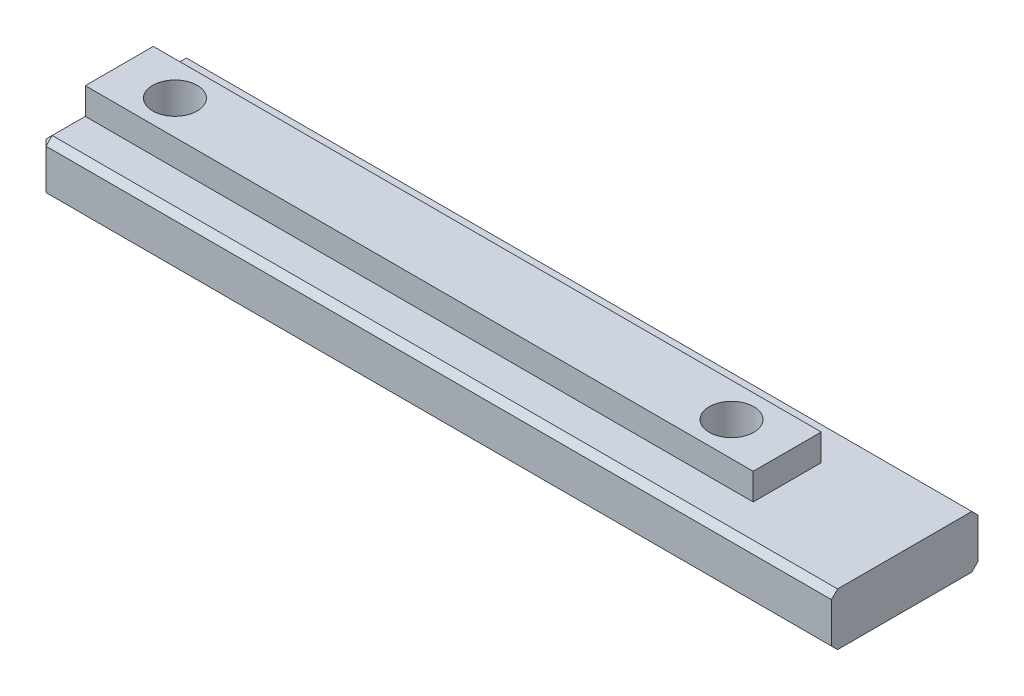
ISO-10303-21;
HEADER;
FILE_DESCRIPTION(('STEP AP214'),'2;1');
FILE_NAME('part.step','',(''),(''),'','','');
FILE_SCHEMA(('AUTOMOTIVE_DESIGN { 1 0 10303 214 1 1 1 1 }'));
ENDSEC;
DATA;
#1=APPLICATION_CONTEXT('core data for automotive mechanical design processes');
#2=APPLICATION_PROTOCOL_DEFINITION('international standard','automotive_design',2000,#1);
#3=PRODUCT_CONTEXT('',#1,'mechanical');
#4=PRODUCT('Part','Part','',(#3));
#5=PRODUCT_RELATED_PRODUCT_CATEGORY('part','',(#4));
#6=PRODUCT_DEFINITION_FORMATION('','',#4);
#7=PRODUCT_DEFINITION_CONTEXT('part definition',#1,'design');
#8=PRODUCT_DEFINITION('design','',#6,#7);
#9=PRODUCT_DEFINITION_SHAPE('','',#8);
#10=(LENGTH_UNIT() NAMED_UNIT(*) SI_UNIT(.MILLI.,.METRE.));
#11=(NAMED_UNIT(*) PLANE_ANGLE_UNIT() SI_UNIT($,.RADIAN.));
#12=(NAMED_UNIT(*) SI_UNIT($,.STERADIAN.) SOLID_ANGLE_UNIT());
#13=UNCERTAINTY_MEASURE_WITH_UNIT(LENGTH_MEASURE(1.E-05),#10,'distance_accuracy_value','');
#14=(GEOMETRIC_REPRESENTATION_CONTEXT(3) GLOBAL_UNCERTAINTY_ASSIGNED_CONTEXT((#13)) GLOBAL_UNIT_ASSIGNED_CONTEXT((#10,
#11,#12)) REPRESENTATION_CONTEXT('',''));
#15=CARTESIAN_POINT('',(0.,0.,0.));
#16=DIRECTION('',(0.,0.,1.));
#17=DIRECTION('',(1.,0.,0.));
#18=AXIS2_PLACEMENT_3D('',#15,#16,#17);
#19=CARTESIAN_POINT('',(0.,0.,0.));
#20=DIRECTION('',(0.,1.,0.));
#21=DIRECTION('',(0.,0.,1.));
#22=AXIS2_PLACEMENT_3D('',#19,#20,#21);
#23=PLANE('',#22);
#24=DIRECTION('',(1.,0.,0.));
#25=VECTOR('',#24,1.);
#26=CARTESIAN_POINT('',(0.,0.,-5.425));
#27=LINE('',#26,#25);
#28=CARTESIAN_POINT('',(-27.,0.,-5.425));
#29=VERTEX_POINT('',#28);
#30=CARTESIAN_POINT('',(36.5,0.,-5.425));
#31=VERTEX_POINT('',#30);
#32=EDGE_CURVE('E304',#29,#31,#27,.T.);
#33=ORIENTED_EDGE('',*,*,#32,.T.);
#34=DIRECTION('',(0.,0.,-1.));
#35=VECTOR('',#34,1.);
#36=CARTESIAN_POINT('',(36.5,0.,5.425));
#37=LINE('',#36,#35);
#38=CARTESIAN_POINT('',(36.5,0.,5.425));
#39=VERTEX_POINT('',#38);
#40=EDGE_CURVE('E207',#39,#31,#37,.T.);
#41=ORIENTED_EDGE('',*,*,#40,.F.);
#42=DIRECTION('',(-1.,0.,0.));
#43=VECTOR('',#42,1.);
#44=CARTESIAN_POINT('',(0.,0.,5.425));
#45=LINE('',#44,#43);
#46=CARTESIAN_POINT('',(-27.,0.,5.425));
#47=VERTEX_POINT('',#46);
#48=EDGE_CURVE('E11',#39,#47,#45,.T.);
#49=ORIENTED_EDGE('',*,*,#48,.T.);
#50=DIRECTION('',(0.,0.,-1.));
#51=VECTOR('',#50,1.);
#52=CARTESIAN_POINT('',(-27.,0.,0.));
#53=LINE('',#52,#51);
#54=EDGE_CURVE('E49',#47,#29,#53,.T.);
#55=ORIENTED_EDGE('',*,*,#54,.T.);
#56=EDGE_LOOP('',(#33,#41,#49,#55));
#57=FACE_BOUND('',#56,.T.);
#58=CARTESIAN_POINT('',(-22.5,0.,0.));
#59=DIRECTION('',(0.,-1.,0.));
#60=DIRECTION('',(0.,0.,-1.));
#61=AXIS2_PLACEMENT_3D('',#58,#59,#60);
#62=CIRCLE('',#61,3.275);
#63=CARTESIAN_POINT('',(-22.5,0.,-3.275));
#64=VERTEX_POINT('',#63);
#65=EDGE_CURVE('E231',#64,#64,#62,.T.);
#66=ORIENTED_EDGE('',*,*,#65,.F.);
#67=EDGE_LOOP('',(#66));
#68=FACE_BOUND('',#67,.T.);
#69=CARTESIAN_POINT('',(22.5,0.,0.));
#70=DIRECTION('',(0.,-1.,0.));
#71=DIRECTION('',(0.,0.,-1.));
#72=AXIS2_PLACEMENT_3D('',#69,#70,#71);
#73=CIRCLE('',#72,3.275);
#74=CARTESIAN_POINT('',(22.5,0.,-3.27499999999999));
#75=VERTEX_POINT('',#74);
#76=EDGE_CURVE('E216',#75,#75,#73,.T.);
#77=ORIENTED_EDGE('',*,*,#76,.F.);
#78=EDGE_LOOP('',(#77));
#79=FACE_BOUND('',#78,.T.);
#80=DIRECTION('',(1.,0.,0.));
#81=VECTOR('',#80,1.);
#82=CARTESIAN_POINT('',(31.1499999999999,0.,2.));
#83=LINE('',#82,#81);
#84=CARTESIAN_POINT('',(31.1499999999999,0.,2.));
#85=VERTEX_POINT('',#84);
#86=CARTESIAN_POINT('',(34.4499999999999,0.,2.));
#87=VERTEX_POINT('',#86);
#88=EDGE_CURVE('E184',#85,#87,#83,.T.);
#89=ORIENTED_EDGE('',*,*,#88,.T.);
#90=DIRECTION('',(0.,0.,-1.));
#91=VECTOR('',#90,1.);
#92=CARTESIAN_POINT('',(34.4499999999999,0.,2.));
#93=LINE('',#92,#91);
#94=CARTESIAN_POINT('',(34.4499999999999,0.,-2.));
#95=VERTEX_POINT('',#94);
#96=EDGE_CURVE('E170',#87,#95,#93,.T.);
#97=ORIENTED_EDGE('',*,*,#96,.T.);
#98=DIRECTION('',(1.,0.,0.));
#99=VECTOR('',#98,1.);
#100=CARTESIAN_POINT('',(31.1499999999999,0.,-2.));
#101=LINE('',#100,#99);
#102=CARTESIAN_POINT('',(31.1499999999999,0.,-2.));
#103=VERTEX_POINT('',#102);
#104=EDGE_CURVE('E176',#103,#95,#101,.T.);
#105=ORIENTED_EDGE('',*,*,#104,.F.);
#106=DIRECTION('',(0.,0.,-1.));
#107=VECTOR('',#106,1.);
#108=CARTESIAN_POINT('',(31.1499999999999,0.,2.));
#109=LINE('',#108,#107);
#110=EDGE_CURVE('E185',#85,#103,#109,.T.);
#111=ORIENTED_EDGE('',*,*,#110,.F.);
#112=EDGE_LOOP('',(#89,#97,#105,#111));
#113=FACE_BOUND('',#112,.T.);
#114=ADVANCED_FACE('F39',(#57,#68,#79,#113),#23,.F.);
#115=CARTESIAN_POINT('',(0.,4.25,0.));
#116=DIRECTION('',(0.,1.,0.));
#117=DIRECTION('',(0.,0.,1.));
#118=AXIS2_PLACEMENT_3D('',#115,#116,#117);
#119=PLANE('',#118);
#120=DIRECTION('',(0.,0.,-1.));
#121=VECTOR('',#120,1.);
#122=CARTESIAN_POINT('',(27.,4.25,2.75));
#123=LINE('',#122,#121);
#124=CARTESIAN_POINT('',(27.,4.25,2.75));
#125=VERTEX_POINT('',#124);
#126=CARTESIAN_POINT('',(27.,4.25,-2.75));
#127=VERTEX_POINT('',#126);
#128=EDGE_CURVE('E65',#125,#127,#123,.T.);
#129=ORIENTED_EDGE('',*,*,#128,.F.);
#130=DIRECTION('',(-1.,0.,0.));
#131=VECTOR('',#130,1.);
#132=CARTESIAN_POINT('',(27.,4.25,2.75));
#133=LINE('',#132,#131);
#134=CARTESIAN_POINT('',(-27.,4.25,2.75));
#135=VERTEX_POINT('',#134);
#136=EDGE_CURVE('E271',#125,#135,#133,.T.);
#137=ORIENTED_EDGE('',*,*,#136,.T.);
#138=DIRECTION('',(0.,0.,1.));
#139=VECTOR('',#138,1.);
#140=CARTESIAN_POINT('',(-27.,4.25,5.925));
#141=LINE('',#140,#139);
#142=CARTESIAN_POINT('',(-27.,4.25,5.425));
#143=VERTEX_POINT('',#142);
#144=EDGE_CURVE('E292',#135,#143,#141,.T.);
#145=ORIENTED_EDGE('',*,*,#144,.T.);
#146=DIRECTION('',(1.,0.,0.));
#147=VECTOR('',#146,1.);
#148=CARTESIAN_POINT('',(27.5,4.25,5.425));
#149=LINE('',#148,#147);
#150=CARTESIAN_POINT('',(36.5,4.25,5.425));
#151=VERTEX_POINT('',#150);
#152=EDGE_CURVE('E296',#143,#151,#149,.T.);
#153=ORIENTED_EDGE('',*,*,#152,.T.);
#154=DIRECTION('',(0.,0.,1.));
#155=VECTOR('',#154,1.);
#156=CARTESIAN_POINT('',(36.5,4.25,-5.425));
#157=LINE('',#156,#155);
#158=CARTESIAN_POINT('',(36.5,4.25,-5.425));
#159=VERTEX_POINT('',#158);
#160=EDGE_CURVE('E195',#159,#151,#157,.T.);
#161=ORIENTED_EDGE('',*,*,#160,.F.);
#162=DIRECTION('',(-1.,0.,0.));
#163=VECTOR('',#162,1.);
#164=CARTESIAN_POINT('',(-27.5,4.25,-5.425));
#165=LINE('',#164,#163);
#166=CARTESIAN_POINT('',(-27.,4.25,-5.425));
#167=VERTEX_POINT('',#166);
#168=EDGE_CURVE('E290',#159,#167,#165,.T.);
#169=ORIENTED_EDGE('',*,*,#168,.T.);
#170=CARTESIAN_POINT('',(-27.,4.25,-2.75));
#171=VERTEX_POINT('',#170);
#172=EDGE_CURVE('E293',#167,#171,#141,.T.);
#173=ORIENTED_EDGE('',*,*,#172,.T.);
#174=DIRECTION('',(-1.,0.,0.));
#175=VECTOR('',#174,1.);
#176=CARTESIAN_POINT('',(27.,4.25,-2.75));
#177=LINE('',#176,#175);
#178=EDGE_CURVE('E268',#127,#171,#177,.T.);
#179=ORIENTED_EDGE('',*,*,#178,.F.);
#180=EDGE_LOOP('',(#129,#137,#145,#153,#161,#169,#173,#179));
#181=FACE_BOUND('',#180,.T.);
#182=ADVANCED_FACE('F351',(#181),#119,.T.);
#183=CARTESIAN_POINT('',(-27.5,4.25,-5.925));
#184=DIRECTION('',(0.,0.,1.));
#185=DIRECTION('',(1.,0.,0.));
#186=AXIS2_PLACEMENT_3D('',#183,#184,#185);
#187=PLANE('',#186);
#188=DIRECTION('',(0.,1.,0.));
#189=VECTOR('',#188,1.);
#190=CARTESIAN_POINT('',(-27.,4.25,-5.925));
#191=LINE('',#190,#189);
#192=CARTESIAN_POINT('',(-27.,0.5,-5.925));
#193=VERTEX_POINT('',#192);
#194=CARTESIAN_POINT('',(-27.,3.75,-5.925));
#195=VERTEX_POINT('',#194);
#196=EDGE_CURVE('E300',#193,#195,#191,.T.);
#197=ORIENTED_EDGE('',*,*,#196,.T.);
#198=DIRECTION('',(1.,0.,0.));
#199=VECTOR('',#198,1.);
#200=CARTESIAN_POINT('',(27.5,3.75,-5.925));
#201=LINE('',#200,#199);
#202=CARTESIAN_POINT('',(36.5,3.75,-5.925));
#203=VERTEX_POINT('',#202);
#204=EDGE_CURVE('E302',#195,#203,#201,.T.);
#205=ORIENTED_EDGE('',*,*,#204,.T.);
#206=DIRECTION('',(0.,1.,0.));
#207=VECTOR('',#206,1.);
#208=CARTESIAN_POINT('',(36.5,0.5,-5.925));
#209=LINE('',#208,#207);
#210=CARTESIAN_POINT('',(36.5,0.5,-5.925));
#211=VERTEX_POINT('',#210);
#212=EDGE_CURVE('E213',#211,#203,#209,.T.);
#213=ORIENTED_EDGE('',*,*,#212,.F.);
#214=DIRECTION('',(-1.,0.,0.));
#215=VECTOR('',#214,1.);
#216=CARTESIAN_POINT('',(-27.5,0.5,-5.925));
#217=LINE('',#216,#215);
#218=EDGE_CURVE('E298',#211,#193,#217,.T.);
#219=ORIENTED_EDGE('',*,*,#218,.T.);
#220=EDGE_LOOP('',(#197,#205,#213,#219));
#221=FACE_BOUND('',#220,.T.);
#222=ADVANCED_FACE('F389',(#221),#187,.F.);
#223=CARTESIAN_POINT('',(-27.5,4.25,-5.925));
#224=DIRECTION('',(1.,0.,0.));
#225=DIRECTION('',(0.,0.,-1.));
#226=AXIS2_PLACEMENT_3D('',#223,#224,#225);
#227=PLANE('',#226);
#228=DIRECTION('',(0.,0.,1.));
#229=VECTOR('',#228,1.);
#230=CARTESIAN_POINT('',(-27.5,0.5,-5.925));
#231=LINE('',#230,#229);
#232=CARTESIAN_POINT('',(-27.5,0.5,-5.425));
#233=VERTEX_POINT('',#232);
#234=CARTESIAN_POINT('',(-27.5,0.5,5.425));
#235=VERTEX_POINT('',#234);
#236=EDGE_CURVE('E281',#233,#235,#231,.T.);
#237=ORIENTED_EDGE('',*,*,#236,.T.);
#238=DIRECTION('',(0.,1.,0.));
#239=VECTOR('',#238,1.);
#240=CARTESIAN_POINT('',(-27.5,4.25,5.425));
#241=LINE('',#240,#239);
#242=CARTESIAN_POINT('',(-27.5,3.75,5.425));
#243=VERTEX_POINT('',#242);
#244=EDGE_CURVE('E287',#235,#243,#241,.T.);
#245=ORIENTED_EDGE('',*,*,#244,.T.);
#246=DIRECTION('',(0.,0.,-1.));
#247=VECTOR('',#246,1.);
#248=CARTESIAN_POINT('',(-27.5,3.75,-5.925));
#249=LINE('',#248,#247);
#250=CARTESIAN_POINT('',(-27.5,3.75,-5.425));
#251=VERTEX_POINT('',#250);
#252=EDGE_CURVE('E285',#243,#251,#249,.T.);
#253=ORIENTED_EDGE('',*,*,#252,.T.);
#254=DIRECTION('',(0.,-1.,0.));
#255=VECTOR('',#254,1.);
#256=CARTESIAN_POINT('',(-27.5,4.25,-5.425));
#257=LINE('',#256,#255);
#258=EDGE_CURVE('E283',#251,#233,#257,.T.);
#259=ORIENTED_EDGE('',*,*,#258,.T.);
#260=EDGE_LOOP('',(#237,#245,#253,#259));
#261=FACE_BOUND('',#260,.T.);
#262=ADVANCED_FACE('F407',(#261),#227,.F.);
#263=CARTESIAN_POINT('',(-27.5,4.25,5.925));
#264=DIRECTION('',(0.,0.,-1.));
#265=DIRECTION('',(-1.,0.,0.));
#266=AXIS2_PLACEMENT_3D('',#263,#264,#265);
#267=PLANE('',#266);
#268=DIRECTION('',(1.,0.,0.));
#269=VECTOR('',#268,1.);
#270=CARTESIAN_POINT('',(-27.5,0.5,5.925));
#271=LINE('',#270,#269);
#272=CARTESIAN_POINT('',(-27.,0.5,5.925));
#273=VERTEX_POINT('',#272);
#274=CARTESIAN_POINT('',(36.5,0.5,5.925));
#275=VERTEX_POINT('',#274);
#276=EDGE_CURVE('E274',#273,#275,#271,.T.);
#277=ORIENTED_EDGE('',*,*,#276,.T.);
#278=DIRECTION('',(0.,-1.,0.));
#279=VECTOR('',#278,1.);
#280=CARTESIAN_POINT('',(36.5,3.75,5.925));
#281=LINE('',#280,#279);
#282=CARTESIAN_POINT('',(36.5,3.75,5.925));
#283=VERTEX_POINT('',#282);
#284=EDGE_CURVE('E201',#283,#275,#281,.T.);
#285=ORIENTED_EDGE('',*,*,#284,.F.);
#286=DIRECTION('',(-1.,0.,0.));
#287=VECTOR('',#286,1.);
#288=CARTESIAN_POINT('',(-27.5,3.75,5.925));
#289=LINE('',#288,#287);
#290=CARTESIAN_POINT('',(-27.,3.75,5.925));
#291=VERTEX_POINT('',#290);
#292=EDGE_CURVE('E279',#283,#291,#289,.T.);
#293=ORIENTED_EDGE('',*,*,#292,.T.);
#294=DIRECTION('',(0.,-1.,0.));
#295=VECTOR('',#294,1.);
#296=CARTESIAN_POINT('',(-27.,4.25,5.925));
#297=LINE('',#296,#295);
#298=EDGE_CURVE('E276',#291,#273,#297,.T.);
#299=ORIENTED_EDGE('',*,*,#298,.T.);
#300=EDGE_LOOP('',(#277,#285,#293,#299));
#301=FACE_BOUND('',#300,.T.);
#302=ADVANCED_FACE('F419',(#301),#267,.F.);
#303=CARTESIAN_POINT('',(0.,4.25,-5.425));
#304=DIRECTION('',(0.,0.707106781186547,-0.707106781186547));
#305=DIRECTION('',(1.,0.,0.));
#306=AXIS2_PLACEMENT_3D('',#303,#304,#305);
#307=PLANE('',#306);
#308=ORIENTED_EDGE('',*,*,#168,.F.);
#309=DIRECTION('',(0.,0.707106781186547,0.707106781186547));
#310=VECTOR('',#309,1.);
#311=CARTESIAN_POINT('',(36.5,3.75,-5.925));
#312=LINE('',#311,#310);
#313=EDGE_CURVE('E187',#203,#159,#312,.T.);
#314=ORIENTED_EDGE('',*,*,#313,.F.);
#315=ORIENTED_EDGE('',*,*,#204,.F.);
#316=DIRECTION('',(0.,-0.707106781186547,-0.707106781186547));
#317=VECTOR('',#316,1.);
#318=CARTESIAN_POINT('',(-27.,4.,-5.675));
#319=LINE('',#318,#317);
#320=EDGE_CURVE('E333',#167,#195,#319,.T.);
#321=ORIENTED_EDGE('',*,*,#320,.F.);
#322=EDGE_LOOP('',(#308,#314,#315,#321));
#323=FACE_BOUND('',#322,.T.);
#324=ADVANCED_FACE('F42',(#323),#307,.T.);
#325=CARTESIAN_POINT('',(-27.5,0.5,-5.925));
#326=DIRECTION('',(0.,0.707106781186547,0.707106781186547));
#327=DIRECTION('',(-1.,0.,0.));
#328=AXIS2_PLACEMENT_3D('',#325,#326,#327);
#329=PLANE('',#328);
#330=ORIENTED_EDGE('',*,*,#218,.F.);
#331=DIRECTION('',(0.,0.707106781186547,-0.707106781186547));
#332=VECTOR('',#331,1.);
#333=CARTESIAN_POINT('',(36.5,0.,-5.425));
#334=LINE('',#333,#332);
#335=EDGE_CURVE('E210',#31,#211,#334,.T.);
#336=ORIENTED_EDGE('',*,*,#335,.F.);
#337=ORIENTED_EDGE('',*,*,#32,.F.);
#338=DIRECTION('',(0.,0.707106781186547,-0.707106781186547));
#339=VECTOR('',#338,1.);
#340=CARTESIAN_POINT('',(-27.,0.25,-5.675));
#341=LINE('',#340,#339);
#342=EDGE_CURVE('E331',#193,#29,#341,.F.);
#343=ORIENTED_EDGE('',*,*,#342,.F.);
#344=EDGE_LOOP('',(#330,#336,#337,#343));
#345=FACE_BOUND('',#344,.T.);
#346=ADVANCED_FACE('F396',(#345),#329,.F.);
#347=CARTESIAN_POINT('',(-27.5,4.25,-5.425));
#348=DIRECTION('',(0.707106781186547,0.,0.707106781186547));
#349=DIRECTION('',(0.,-1.,0.));
#350=AXIS2_PLACEMENT_3D('',#347,#348,#349);
#351=PLANE('',#350);
#352=DIRECTION('',(0.707106781186547,0.,-0.707106781186547));
#353=VECTOR('',#352,1.);
#354=CARTESIAN_POINT('',(-27.5,3.75,-5.425));
#355=LINE('',#354,#353);
#356=EDGE_CURVE('E44',#195,#251,#355,.F.);
#357=ORIENTED_EDGE('',*,*,#356,.F.);
#358=ORIENTED_EDGE('',*,*,#196,.F.);
#359=DIRECTION('',(-0.707106781186547,0.,0.707106781186547));
#360=VECTOR('',#359,1.);
#361=CARTESIAN_POINT('',(-27.5,0.5,-5.425));
#362=LINE('',#361,#360);
#363=EDGE_CURVE('E328',#233,#193,#362,.F.);
#364=ORIENTED_EDGE('',*,*,#363,.F.);
#365=ORIENTED_EDGE('',*,*,#258,.F.);
#366=EDGE_LOOP('',(#357,#358,#364,#365));
#367=FACE_BOUND('',#366,.T.);
#368=ADVANCED_FACE('F392',(#367),#351,.F.);
#369=CARTESIAN_POINT('',(-27.5,3.75,-5.425));
#370=DIRECTION('',(-0.577350269189626,0.577350269189626,-0.577350269189626));
#371=DIRECTION('',(-0.707106781186547,0.,0.707106781186547));
#372=AXIS2_PLACEMENT_3D('',#369,#370,#371);
#373=PLANE('',#372);
#374=ORIENTED_EDGE('',*,*,#320,.T.);
#375=ORIENTED_EDGE('',*,*,#356,.T.);
#376=DIRECTION('',(0.707106781186547,0.707106781186547,0.));
#377=VECTOR('',#376,1.);
#378=CARTESIAN_POINT('',(-27.5,3.75,-5.425));
#379=LINE('',#378,#377);
#380=EDGE_CURVE('E325',#167,#251,#379,.F.);
#381=ORIENTED_EDGE('',*,*,#380,.F.);
#382=EDGE_LOOP('',(#374,#375,#381));
#383=FACE_BOUND('',#382,.T.);
#384=ADVANCED_FACE('F340',(#383),#373,.T.);
#385=CARTESIAN_POINT('',(-27.5,0.5,-5.425));
#386=DIRECTION('',(-0.577350269189626,-0.577350269189626,-0.577350269189626));
#387=DIRECTION('',(-0.707106781186547,0.,0.707106781186547));
#388=AXIS2_PLACEMENT_3D('',#385,#386,#387);
#389=PLANE('',#388);
#390=ORIENTED_EDGE('',*,*,#363,.T.);
#391=ORIENTED_EDGE('',*,*,#342,.T.);
#392=DIRECTION('',(0.707106781186547,-0.707106781186547,0.));
#393=VECTOR('',#392,1.);
#394=CARTESIAN_POINT('',(-27.5,0.5,-5.425));
#395=LINE('',#394,#393);
#396=EDGE_CURVE('E322',#233,#29,#395,.T.);
#397=ORIENTED_EDGE('',*,*,#396,.F.);
#398=EDGE_LOOP('',(#390,#391,#397));
#399=FACE_BOUND('',#398,.T.);
#400=ADVANCED_FACE('F399',(#399),#389,.T.);
#401=CARTESIAN_POINT('',(-27.,4.25,0.));
#402=DIRECTION('',(-0.707106781186547,0.707106781186547,0.));
#403=DIRECTION('',(0.,0.,-1.));
#404=AXIS2_PLACEMENT_3D('',#401,#402,#403);
#405=PLANE('',#404);
#406=ORIENTED_EDGE('',*,*,#380,.T.);
#407=ORIENTED_EDGE('',*,*,#252,.F.);
#408=DIRECTION('',(-0.707106781186547,-0.707106781186547,0.));
#409=VECTOR('',#408,1.);
#410=CARTESIAN_POINT('',(-27.5,3.75,5.425));
#411=LINE('',#410,#409);
#412=EDGE_CURVE('E319',#143,#243,#411,.T.);
#413=ORIENTED_EDGE('',*,*,#412,.F.);
#414=ORIENTED_EDGE('',*,*,#144,.F.);
#415=DIRECTION('',(0.,0.,-1.));
#416=VECTOR('',#415,1.);
#417=CARTESIAN_POINT('',(-27.,4.25,2.75));
#418=LINE('',#417,#416);
#419=EDGE_CURVE('E249',#135,#171,#418,.T.);
#420=ORIENTED_EDGE('',*,*,#419,.T.);
#421=ORIENTED_EDGE('',*,*,#172,.F.);
#422=EDGE_LOOP('',(#406,#407,#413,#414,#420,#421));
#423=FACE_BOUND('',#422,.T.);
#424=ADVANCED_FACE('F347',(#423),#405,.T.);
#425=CARTESIAN_POINT('',(0.,4.25,5.425));
#426=DIRECTION('',(0.,0.707106781186547,0.707106781186547));
#427=DIRECTION('',(-1.,0.,0.));
#428=AXIS2_PLACEMENT_3D('',#425,#426,#427);
#429=PLANE('',#428);
#430=ORIENTED_EDGE('',*,*,#292,.F.);
#431=DIRECTION('',(0.,-0.707106781186547,0.707106781186547));
#432=VECTOR('',#431,1.);
#433=CARTESIAN_POINT('',(36.5,4.25,5.425));
#434=LINE('',#433,#432);
#435=EDGE_CURVE('E198',#151,#283,#434,.T.);
#436=ORIENTED_EDGE('',*,*,#435,.F.);
#437=ORIENTED_EDGE('',*,*,#152,.F.);
#438=DIRECTION('',(0.,0.707106781186547,-0.707106781186547));
#439=VECTOR('',#438,1.);
#440=CARTESIAN_POINT('',(-27.,4.,5.675));
#441=LINE('',#440,#439);
#442=EDGE_CURVE('E316',#291,#143,#441,.T.);
#443=ORIENTED_EDGE('',*,*,#442,.F.);
#444=EDGE_LOOP('',(#430,#436,#437,#443));
#445=FACE_BOUND('',#444,.T.);
#446=ADVANCED_FACE('F379',(#445),#429,.T.);
#447=CARTESIAN_POINT('',(-27.5,0.5,5.925));
#448=DIRECTION('',(0.,0.707106781186547,-0.707106781186547));
#449=DIRECTION('',(1.,0.,0.));
#450=AXIS2_PLACEMENT_3D('',#447,#448,#449);
#451=PLANE('',#450);
#452=ORIENTED_EDGE('',*,*,#48,.F.);
#453=DIRECTION('',(0.,-0.707106781186547,-0.707106781186547));
#454=VECTOR('',#453,1.);
#455=CARTESIAN_POINT('',(36.5,0.5,5.925));
#456=LINE('',#455,#454);
#457=EDGE_CURVE('E204',#275,#39,#456,.T.);
#458=ORIENTED_EDGE('',*,*,#457,.F.);
#459=ORIENTED_EDGE('',*,*,#276,.F.);
#460=DIRECTION('',(0.,-0.707106781186547,-0.707106781186547));
#461=VECTOR('',#460,1.);
#462=CARTESIAN_POINT('',(-27.,0.5,5.925));
#463=LINE('',#462,#461);
#464=EDGE_CURVE('E313',#47,#273,#463,.F.);
#465=ORIENTED_EDGE('',*,*,#464,.F.);
#466=EDGE_LOOP('',(#452,#458,#459,#465));
#467=FACE_BOUND('',#466,.T.);
#468=ADVANCED_FACE('F417',(#467),#451,.F.);
#469=CARTESIAN_POINT('',(-27.5,0.5,-5.925));
#470=DIRECTION('',(0.707106781186547,0.707106781186547,0.));
#471=DIRECTION('',(0.,0.,1.));
#472=AXIS2_PLACEMENT_3D('',#469,#470,#471);
#473=PLANE('',#472);
#474=ORIENTED_EDGE('',*,*,#396,.T.);
#475=ORIENTED_EDGE('',*,*,#54,.F.);
#476=DIRECTION('',(-0.707106781186547,0.707106781186547,0.));
#477=VECTOR('',#476,1.);
#478=CARTESIAN_POINT('',(-27.25,0.25,5.425));
#479=LINE('',#478,#477);
#480=EDGE_CURVE('E310',#235,#47,#479,.F.);
#481=ORIENTED_EDGE('',*,*,#480,.F.);
#482=ORIENTED_EDGE('',*,*,#236,.F.);
#483=EDGE_LOOP('',(#474,#475,#481,#482));
#484=FACE_BOUND('',#483,.T.);
#485=ADVANCED_FACE('F404',(#484),#473,.F.);
#486=CARTESIAN_POINT('',(-27.5,3.75,5.425));
#487=DIRECTION('',(-0.577350269189626,0.577350269189626,0.577350269189626));
#488=DIRECTION('',(0.707106781186547,0.,0.707106781186547));
#489=AXIS2_PLACEMENT_3D('',#486,#487,#488);
#490=PLANE('',#489);
#491=ORIENTED_EDGE('',*,*,#442,.T.);
#492=ORIENTED_EDGE('',*,*,#412,.T.);
#493=DIRECTION('',(-0.707106781186547,0.,-0.707106781186547));
#494=VECTOR('',#493,1.);
#495=CARTESIAN_POINT('',(-27.5,3.75,5.425));
#496=LINE('',#495,#494);
#497=EDGE_CURVE('E308',#291,#243,#496,.T.);
#498=ORIENTED_EDGE('',*,*,#497,.F.);
#499=EDGE_LOOP('',(#491,#492,#498));
#500=FACE_BOUND('',#499,.T.);
#501=ADVANCED_FACE('F376',(#500),#490,.T.);
#502=CARTESIAN_POINT('',(-27.,0.5,5.925));
#503=DIRECTION('',(-0.577350269189626,-0.577350269189626,0.577350269189626));
#504=DIRECTION('',(0.707106781186547,0.,0.707106781186547));
#505=AXIS2_PLACEMENT_3D('',#502,#503,#504);
#506=PLANE('',#505);
#507=ORIENTED_EDGE('',*,*,#480,.T.);
#508=ORIENTED_EDGE('',*,*,#464,.T.);
#509=DIRECTION('',(0.707106781186547,0.,0.707106781186547));
#510=VECTOR('',#509,1.);
#511=CARTESIAN_POINT('',(-27.,0.5,5.925));
#512=LINE('',#511,#510);
#513=EDGE_CURVE('E273',#235,#273,#512,.T.);
#514=ORIENTED_EDGE('',*,*,#513,.F.);
#515=EDGE_LOOP('',(#507,#508,#514));
#516=FACE_BOUND('',#515,.T.);
#517=ADVANCED_FACE('F412',(#516),#506,.T.);
#518=CARTESIAN_POINT('',(-27.,4.25,5.925));
#519=DIRECTION('',(0.707106781186547,0.,-0.707106781186547));
#520=DIRECTION('',(0.,-1.,0.));
#521=AXIS2_PLACEMENT_3D('',#518,#519,#520);
#522=PLANE('',#521);
#523=ORIENTED_EDGE('',*,*,#497,.T.);
#524=ORIENTED_EDGE('',*,*,#244,.F.);
#525=ORIENTED_EDGE('',*,*,#513,.T.);
#526=ORIENTED_EDGE('',*,*,#298,.F.);
#527=EDGE_LOOP('',(#523,#524,#525,#526));
#528=FACE_BOUND('',#527,.T.);
#529=ADVANCED_FACE('F410',(#528),#522,.F.);
#530=CARTESIAN_POINT('',(27.,4.25,2.75));
#531=DIRECTION('',(0.,0.,-1.));
#532=DIRECTION('',(-1.,0.,0.));
#533=AXIS2_PLACEMENT_3D('',#530,#531,#532);
#534=PLANE('',#533);
#535=DIRECTION('',(-1.,0.,0.));
#536=VECTOR('',#535,1.);
#537=CARTESIAN_POINT('',(27.,6.4,2.75));
#538=LINE('',#537,#536);
#539=CARTESIAN_POINT('',(27.,6.4,2.75));
#540=VERTEX_POINT('',#539);
#541=CARTESIAN_POINT('',(-27.,6.4,2.75));
#542=VERTEX_POINT('',#541);
#543=EDGE_CURVE('E264',#540,#542,#538,.T.);
#544=ORIENTED_EDGE('',*,*,#543,.T.);
#545=DIRECTION('',(0.,-1.,0.));
#546=VECTOR('',#545,1.);
#547=CARTESIAN_POINT('',(-27.,4.25,2.75));
#548=LINE('',#547,#546);
#549=EDGE_CURVE('E246',#542,#135,#548,.T.);
#550=ORIENTED_EDGE('',*,*,#549,.T.);
#551=ORIENTED_EDGE('',*,*,#136,.F.);
#552=DIRECTION('',(0.,-1.,0.));
#553=VECTOR('',#552,1.);
#554=CARTESIAN_POINT('',(27.,4.25,2.75));
#555=LINE('',#554,#553);
#556=EDGE_CURVE('E257',#540,#125,#555,.T.);
#557=ORIENTED_EDGE('',*,*,#556,.F.);
#558=EDGE_LOOP('',(#544,#550,#551,#557));
#559=FACE_BOUND('',#558,.T.);
#560=ADVANCED_FACE('F371',(#559),#534,.F.);
#561=CARTESIAN_POINT('',(27.,4.25,-2.75));
#562=DIRECTION('',(0.,0.,1.));
#563=DIRECTION('',(1.,0.,0.));
#564=AXIS2_PLACEMENT_3D('',#561,#562,#563);
#565=PLANE('',#564);
#566=ORIENTED_EDGE('',*,*,#178,.T.);
#567=DIRECTION('',(0.,1.,0.));
#568=VECTOR('',#567,1.);
#569=CARTESIAN_POINT('',(-27.,4.25,-2.75));
#570=LINE('',#569,#568);
#571=CARTESIAN_POINT('',(-27.,6.4,-2.75));
#572=VERTEX_POINT('',#571);
#573=EDGE_CURVE('E251',#171,#572,#570,.T.);
#574=ORIENTED_EDGE('',*,*,#573,.T.);
#575=DIRECTION('',(-1.,0.,0.));
#576=VECTOR('',#575,1.);
#577=CARTESIAN_POINT('',(27.,6.4,-2.75));
#578=LINE('',#577,#576);
#579=CARTESIAN_POINT('',(27.,6.4,-2.75));
#580=VERTEX_POINT('',#579);
#581=EDGE_CURVE('E266',#580,#572,#578,.T.);
#582=ORIENTED_EDGE('',*,*,#581,.F.);
#583=DIRECTION('',(0.,1.,0.));
#584=VECTOR('',#583,1.);
#585=CARTESIAN_POINT('',(27.,4.25,-2.75));
#586=LINE('',#585,#584);
#587=EDGE_CURVE('E260',#127,#580,#586,.T.);
#588=ORIENTED_EDGE('',*,*,#587,.F.);
#589=EDGE_LOOP('',(#566,#574,#582,#588));
#590=FACE_BOUND('',#589,.T.);
#591=ADVANCED_FACE('F356',(#590),#565,.F.);
#592=CARTESIAN_POINT('',(27.,6.4,2.75));
#593=DIRECTION('',(0.,-1.,0.));
#594=DIRECTION('',(0.,0.,-1.));
#595=AXIS2_PLACEMENT_3D('',#592,#593,#594);
#596=PLANE('',#595);
#597=CARTESIAN_POINT('',(22.5,6.4,0.));
#598=DIRECTION('',(0.,-1.,0.));
#599=DIRECTION('',(0.,0.,-1.));
#600=AXIS2_PLACEMENT_3D('',#597,#598,#599);
#601=CIRCLE('',#600,1.8);
#602=CARTESIAN_POINT('',(22.5,6.4,-1.79999999999999));
#603=VERTEX_POINT('',#602);
#604=EDGE_CURVE('E228',#603,#603,#601,.T.);
#605=ORIENTED_EDGE('',*,*,#604,.T.);
#606=EDGE_LOOP('',(#605));
#607=FACE_BOUND('',#606,.T.);
#608=CARTESIAN_POINT('',(-22.5,6.4,0.));
#609=DIRECTION('',(0.,-1.,0.));
#610=DIRECTION('',(0.,0.,-1.));
#611=AXIS2_PLACEMENT_3D('',#608,#609,#610);
#612=CIRCLE('',#611,1.8);
#613=CARTESIAN_POINT('',(-22.5,6.4,-1.8));
#614=VERTEX_POINT('',#613);
#615=EDGE_CURVE('E243',#614,#614,#612,.T.);
#616=ORIENTED_EDGE('',*,*,#615,.T.);
#617=EDGE_LOOP('',(#616));
#618=FACE_BOUND('',#617,.T.);
#619=ORIENTED_EDGE('',*,*,#581,.T.);
#620=DIRECTION('',(0.,0.,1.));
#621=VECTOR('',#620,1.);
#622=CARTESIAN_POINT('',(-27.,6.4,2.75));
#623=LINE('',#622,#621);
#624=EDGE_CURVE('E254',#572,#542,#623,.T.);
#625=ORIENTED_EDGE('',*,*,#624,.T.);
#626=ORIENTED_EDGE('',*,*,#543,.F.);
#627=DIRECTION('',(0.,0.,1.));
#628=VECTOR('',#627,1.);
#629=CARTESIAN_POINT('',(27.,6.4,2.75));
#630=LINE('',#629,#628);
#631=EDGE_CURVE('E262',#580,#540,#630,.T.);
#632=ORIENTED_EDGE('',*,*,#631,.F.);
#633=EDGE_LOOP('',(#619,#625,#626,#632));
#634=FACE_BOUND('',#633,.T.);
#635=ADVANCED_FACE('F364',(#607,#618,#634),#596,.F.);
#636=CARTESIAN_POINT('',(27.,0.,0.));
#637=DIRECTION('',(-1.,0.,0.));
#638=DIRECTION('',(0.,0.,1.));
#639=AXIS2_PLACEMENT_3D('',#636,#637,#638);
#640=PLANE('',#639);
#641=ORIENTED_EDGE('',*,*,#556,.T.);
#642=ORIENTED_EDGE('',*,*,#128,.T.);
#643=ORIENTED_EDGE('',*,*,#587,.T.);
#644=ORIENTED_EDGE('',*,*,#631,.T.);
#645=EDGE_LOOP('',(#641,#642,#643,#644));
#646=FACE_BOUND('',#645,.T.);
#647=ADVANCED_FACE('F368',(#646),#640,.F.);
#648=CARTESIAN_POINT('',(-27.,0.,0.));
#649=DIRECTION('',(-1.,0.,0.));
#650=DIRECTION('',(0.,0.,1.));
#651=AXIS2_PLACEMENT_3D('',#648,#649,#650);
#652=PLANE('',#651);
#653=ORIENTED_EDGE('',*,*,#549,.F.);
#654=ORIENTED_EDGE('',*,*,#624,.F.);
#655=ORIENTED_EDGE('',*,*,#573,.F.);
#656=ORIENTED_EDGE('',*,*,#419,.F.);
#657=EDGE_LOOP('',(#653,#654,#655,#656));
#658=FACE_BOUND('',#657,.T.);
#659=ADVANCED_FACE('F361',(#658),#652,.T.);
#660=CARTESIAN_POINT('',(-22.5,0.,0.));
#661=DIRECTION('',(0.,-1.,0.));
#662=DIRECTION('',(0.,0.,-1.));
#663=AXIS2_PLACEMENT_3D('',#660,#661,#662);
#664=CYLINDRICAL_SURFACE('',#663,1.8);
#665=ORIENTED_EDGE('',*,*,#615,.F.);
#666=EDGE_LOOP('',(#665));
#667=FACE_BOUND('',#666,.T.);
#668=CARTESIAN_POINT('',(-22.5,2.2,0.));
#669=DIRECTION('',(0.,-1.,0.));
#670=DIRECTION('',(0.,0.,-1.));
#671=AXIS2_PLACEMENT_3D('',#668,#669,#670);
#672=CIRCLE('',#671,1.8);
#673=CARTESIAN_POINT('',(-22.5,2.2,-1.8));
#674=VERTEX_POINT('',#673);
#675=EDGE_CURVE('E240',#674,#674,#672,.T.);
#676=ORIENTED_EDGE('',*,*,#675,.T.);
#677=EDGE_LOOP('',(#676));
#678=FACE_BOUND('',#677,.T.);
#679=ADVANCED_FACE('F464',(#667,#678),#664,.F.);
#680=CARTESIAN_POINT('',(-19.25,2.2,0.));
#681=DIRECTION('',(0.,1.,0.));
#682=DIRECTION('',(0.,0.,1.));
#683=AXIS2_PLACEMENT_3D('',#680,#681,#682);
#684=PLANE('',#683);
#685=ORIENTED_EDGE('',*,*,#675,.F.);
#686=EDGE_LOOP('',(#685));
#687=FACE_BOUND('',#686,.T.);
#688=CARTESIAN_POINT('',(-22.5,2.2,0.));
#689=DIRECTION('',(0.,-1.,0.));
#690=DIRECTION('',(0.,0.,-1.));
#691=AXIS2_PLACEMENT_3D('',#688,#689,#690);
#692=CIRCLE('',#691,3.25);
#693=CARTESIAN_POINT('',(-22.5,2.2,-3.25));
#694=VERTEX_POINT('',#693);
#695=EDGE_CURVE('E237',#694,#694,#692,.T.);
#696=ORIENTED_EDGE('',*,*,#695,.T.);
#697=EDGE_LOOP('',(#696));
#698=FACE_BOUND('',#697,.T.);
#699=ADVANCED_FACE('F460',(#687,#698),#684,.F.);
#700=CARTESIAN_POINT('',(-22.5,0.,0.));
#701=DIRECTION('',(0.,-1.,0.));
#702=DIRECTION('',(0.,0.,-1.));
#703=AXIS2_PLACEMENT_3D('',#700,#701,#702);
#704=CYLINDRICAL_SURFACE('',#703,3.25);
#705=ORIENTED_EDGE('',*,*,#695,.F.);
#706=EDGE_LOOP('',(#705));
#707=FACE_BOUND('',#706,.T.);
#708=CARTESIAN_POINT('',(-22.5,0.0250000000000001,0.));
#709=DIRECTION('',(0.,-1.,0.));
#710=DIRECTION('',(0.,0.,-1.));
#711=AXIS2_PLACEMENT_3D('',#708,#709,#710);
#712=CIRCLE('',#711,3.25);
#713=CARTESIAN_POINT('',(-22.5,0.0250000000000001,-3.25));
#714=VERTEX_POINT('',#713);
#715=EDGE_CURVE('E234',#714,#714,#712,.T.);
#716=ORIENTED_EDGE('',*,*,#715,.T.);
#717=EDGE_LOOP('',(#716));
#718=FACE_BOUND('',#717,.T.);
#719=ADVANCED_FACE('F456',(#707,#718),#704,.F.);
#720=CARTESIAN_POINT('',(-22.5,0.,0.));
#721=DIRECTION('',(0.,-1.,0.));
#722=DIRECTION('',(0.,0.,-1.));
#723=AXIS2_PLACEMENT_3D('',#720,#721,#722);
#724=CONICAL_SURFACE('',#723,3.275,0.78539816339739);
#725=ORIENTED_EDGE('',*,*,#715,.F.);
#726=EDGE_LOOP('',(#725));
#727=FACE_BOUND('',#726,.T.);
#728=ORIENTED_EDGE('',*,*,#65,.T.);
#729=EDGE_LOOP('',(#728));
#730=FACE_BOUND('',#729,.T.);
#731=ADVANCED_FACE('F452',(#727,#730),#724,.F.);
#732=CARTESIAN_POINT('',(22.5,0.,0.));
#733=DIRECTION('',(0.,-1.,0.));
#734=DIRECTION('',(0.,0.,-1.));
#735=AXIS2_PLACEMENT_3D('',#732,#733,#734);
#736=CYLINDRICAL_SURFACE('',#735,1.8);
#737=ORIENTED_EDGE('',*,*,#604,.F.);
#738=EDGE_LOOP('',(#737));
#739=FACE_BOUND('',#738,.T.);
#740=CARTESIAN_POINT('',(22.5,2.2,0.));
#741=DIRECTION('',(0.,-1.,0.));
#742=DIRECTION('',(0.,0.,-1.));
#743=AXIS2_PLACEMENT_3D('',#740,#741,#742);
#744=CIRCLE('',#743,1.8);
#745=CARTESIAN_POINT('',(22.5,2.2,-1.79999999999999));
#746=VERTEX_POINT('',#745);
#747=EDGE_CURVE('E225',#746,#746,#744,.T.);
#748=ORIENTED_EDGE('',*,*,#747,.T.);
#749=EDGE_LOOP('',(#748));
#750=FACE_BOUND('',#749,.T.);
#751=ADVANCED_FACE('F448',(#739,#750),#736,.F.);
#752=CARTESIAN_POINT('',(25.75,2.2,0.));
#753=DIRECTION('',(0.,1.,0.));
#754=DIRECTION('',(0.,0.,1.));
#755=AXIS2_PLACEMENT_3D('',#752,#753,#754);
#756=PLANE('',#755);
#757=ORIENTED_EDGE('',*,*,#747,.F.);
#758=EDGE_LOOP('',(#757));
#759=FACE_BOUND('',#758,.T.);
#760=CARTESIAN_POINT('',(22.5,2.2,0.));
#761=DIRECTION('',(0.,-1.,0.));
#762=DIRECTION('',(0.,0.,-1.));
#763=AXIS2_PLACEMENT_3D('',#760,#761,#762);
#764=CIRCLE('',#763,3.25);
#765=CARTESIAN_POINT('',(22.5,2.2,-3.24999999999999));
#766=VERTEX_POINT('',#765);
#767=EDGE_CURVE('E222',#766,#766,#764,.T.);
#768=ORIENTED_EDGE('',*,*,#767,.T.);
#769=EDGE_LOOP('',(#768));
#770=FACE_BOUND('',#769,.T.);
#771=ADVANCED_FACE('F440',(#759,#770),#756,.F.);
#772=CARTESIAN_POINT('',(22.5,0.,0.));
#773=DIRECTION('',(0.,-1.,0.));
#774=DIRECTION('',(0.,0.,-1.));
#775=AXIS2_PLACEMENT_3D('',#772,#773,#774);
#776=CYLINDRICAL_SURFACE('',#775,3.25);
#777=ORIENTED_EDGE('',*,*,#767,.F.);
#778=EDGE_LOOP('',(#777));
#779=FACE_BOUND('',#778,.T.);
#780=CARTESIAN_POINT('',(22.5,0.0250000000000001,0.));
#781=DIRECTION('',(0.,-1.,0.));
#782=DIRECTION('',(0.,0.,-1.));
#783=AXIS2_PLACEMENT_3D('',#780,#781,#782);
#784=CIRCLE('',#783,3.25);
#785=CARTESIAN_POINT('',(22.5,0.0250000000000001,-3.24999999999999));
#786=VERTEX_POINT('',#785);
#787=EDGE_CURVE('E219',#786,#786,#784,.T.);
#788=ORIENTED_EDGE('',*,*,#787,.T.);
#789=EDGE_LOOP('',(#788));
#790=FACE_BOUND('',#789,.T.);
#791=ADVANCED_FACE('F431',(#779,#790),#776,.F.);
#792=CARTESIAN_POINT('',(22.5,0.,0.));
#793=DIRECTION('',(0.,-1.,0.));
#794=DIRECTION('',(0.,0.,-1.));
#795=AXIS2_PLACEMENT_3D('',#792,#793,#794);
#796=CONICAL_SURFACE('',#795,3.275,0.78539816339739);
#797=ORIENTED_EDGE('',*,*,#787,.F.);
#798=EDGE_LOOP('',(#797));
#799=FACE_BOUND('',#798,.T.);
#800=ORIENTED_EDGE('',*,*,#76,.T.);
#801=EDGE_LOOP('',(#800));
#802=FACE_BOUND('',#801,.T.);
#803=ADVANCED_FACE('F429',(#799,#802),#796,.F.);
#804=CARTESIAN_POINT('',(36.5,0.,0.));
#805=DIRECTION('',(1.,0.,0.));
#806=DIRECTION('',(0.,0.,-1.));
#807=AXIS2_PLACEMENT_3D('',#804,#805,#806);
#808=PLANE('',#807);
#809=ORIENTED_EDGE('',*,*,#313,.T.);
#810=ORIENTED_EDGE('',*,*,#160,.T.);
#811=ORIENTED_EDGE('',*,*,#435,.T.);
#812=ORIENTED_EDGE('',*,*,#284,.T.);
#813=ORIENTED_EDGE('',*,*,#457,.T.);
#814=ORIENTED_EDGE('',*,*,#40,.T.);
#815=ORIENTED_EDGE('',*,*,#335,.T.);
#816=ORIENTED_EDGE('',*,*,#212,.T.);
#817=EDGE_LOOP('',(#809,#810,#811,#812,#813,#814,#815,#816));
#818=FACE_BOUND('',#817,.T.);
#819=ADVANCED_FACE('F382',(#818),#808,.T.);
#820=CARTESIAN_POINT('',(31.1499999999999,0.,2.));
#821=DIRECTION('',(1.,0.,0.));
#822=DIRECTION('',(0.,0.,-1.));
#823=AXIS2_PLACEMENT_3D('',#820,#821,#822);
#824=PLANE('',#823);
#825=DIRECTION('',(0.,0.,-1.));
#826=VECTOR('',#825,1.);
#827=CARTESIAN_POINT('',(31.1499999999999,2.5,2.));
#828=LINE('',#827,#826);
#829=CARTESIAN_POINT('',(31.1499999999999,2.5,2.));
#830=VERTEX_POINT('',#829);
#831=CARTESIAN_POINT('',(31.1499999999999,2.5,-2.));
#832=VERTEX_POINT('',#831);
#833=EDGE_CURVE('E189',#830,#832,#828,.T.);
#834=ORIENTED_EDGE('',*,*,#833,.F.);
#835=DIRECTION('',(0.,-1.,0.));
#836=VECTOR('',#835,1.);
#837=CARTESIAN_POINT('',(31.1499999999999,0.,2.));
#838=LINE('',#837,#836);
#839=EDGE_CURVE('E633',#830,#85,#838,.T.);
#840=ORIENTED_EDGE('',*,*,#839,.T.);
#841=ORIENTED_EDGE('',*,*,#110,.T.);
#842=DIRECTION('',(0.,-1.,0.));
#843=VECTOR('',#842,1.);
#844=CARTESIAN_POINT('',(31.1499999999999,0.,-2.));
#845=LINE('',#844,#843);
#846=EDGE_CURVE('E57',#832,#103,#845,.T.);
#847=ORIENTED_EDGE('',*,*,#846,.F.);
#848=EDGE_LOOP('',(#834,#840,#841,#847));
#849=FACE_BOUND('',#848,.T.);
#850=ADVANCED_FACE('F438',(#849),#824,.T.);
#851=CARTESIAN_POINT('',(34.4499999999999,0.,2.));
#852=DIRECTION('',(-1.,0.,0.));
#853=DIRECTION('',(0.,0.,1.));
#854=AXIS2_PLACEMENT_3D('',#851,#852,#853);
#855=PLANE('',#854);
#856=ORIENTED_EDGE('',*,*,#96,.F.);
#857=DIRECTION('',(0.,1.,0.));
#858=VECTOR('',#857,1.);
#859=CARTESIAN_POINT('',(34.4499999999999,0.,2.));
#860=LINE('',#859,#858);
#861=CARTESIAN_POINT('',(34.4499999999999,2.5,2.));
#862=VERTEX_POINT('',#861);
#863=EDGE_CURVE('E637',#87,#862,#860,.T.);
#864=ORIENTED_EDGE('',*,*,#863,.T.);
#865=DIRECTION('',(0.,0.,-1.));
#866=VECTOR('',#865,1.);
#867=CARTESIAN_POINT('',(34.4499999999999,2.5,2.));
#868=LINE('',#867,#866);
#869=CARTESIAN_POINT('',(34.4499999999999,2.5,-2.));
#870=VERTEX_POINT('',#869);
#871=EDGE_CURVE('E173',#862,#870,#868,.T.);
#872=ORIENTED_EDGE('',*,*,#871,.T.);
#873=DIRECTION('',(0.,1.,0.));
#874=VECTOR('',#873,1.);
#875=CARTESIAN_POINT('',(34.4499999999999,0.,-2.));
#876=LINE('',#875,#874);
#877=EDGE_CURVE('E167',#95,#870,#876,.T.);
#878=ORIENTED_EDGE('',*,*,#877,.F.);
#879=EDGE_LOOP('',(#856,#864,#872,#878));
#880=FACE_BOUND('',#879,.T.);
#881=ADVANCED_FACE('F168',(#880),#855,.T.);
#882=CARTESIAN_POINT('',(31.1499999999999,2.5,2.));
#883=DIRECTION('',(0.,-1.,0.));
#884=DIRECTION('',(0.,0.,-1.));
#885=AXIS2_PLACEMENT_3D('',#882,#883,#884);
#886=PLANE('',#885);
#887=ORIENTED_EDGE('',*,*,#871,.F.);
#888=DIRECTION('',(-1.,0.,0.));
#889=VECTOR('',#888,1.);
#890=CARTESIAN_POINT('',(31.1499999999999,2.5,2.));
#891=LINE('',#890,#889);
#892=EDGE_CURVE('E634',#862,#830,#891,.T.);
#893=ORIENTED_EDGE('',*,*,#892,.T.);
#894=ORIENTED_EDGE('',*,*,#833,.T.);
#895=DIRECTION('',(-1.,0.,0.));
#896=VECTOR('',#895,1.);
#897=CARTESIAN_POINT('',(31.1499999999999,2.5,-2.));
#898=LINE('',#897,#896);
#899=EDGE_CURVE('E175',#870,#832,#898,.T.);
#900=ORIENTED_EDGE('',*,*,#899,.F.);
#901=EDGE_LOOP('',(#887,#893,#894,#900));
#902=FACE_BOUND('',#901,.T.);
#903=ADVANCED_FACE('F590',(#902),#886,.T.);
#904=CARTESIAN_POINT('',(0.,0.,2.));
#905=DIRECTION('',(0.,0.,-1.));
#906=DIRECTION('',(-1.,0.,0.));
#907=AXIS2_PLACEMENT_3D('',#904,#905,#906);
#908=PLANE('',#907);
#909=ORIENTED_EDGE('',*,*,#839,.F.);
#910=ORIENTED_EDGE('',*,*,#892,.F.);
#911=ORIENTED_EDGE('',*,*,#863,.F.);
#912=ORIENTED_EDGE('',*,*,#88,.F.);
#913=EDGE_LOOP('',(#909,#910,#911,#912));
#914=FACE_BOUND('',#913,.T.);
#915=ADVANCED_FACE('F600',(#914),#908,.T.);
#916=CARTESIAN_POINT('',(0.,0.,-2.));
#917=DIRECTION('',(0.,0.,-1.));
#918=DIRECTION('',(-1.,0.,0.));
#919=AXIS2_PLACEMENT_3D('',#916,#917,#918);
#920=PLANE('',#919);
#921=ORIENTED_EDGE('',*,*,#846,.T.);
#922=ORIENTED_EDGE('',*,*,#104,.T.);
#923=ORIENTED_EDGE('',*,*,#877,.T.);
#924=ORIENTED_EDGE('',*,*,#899,.T.);
#925=EDGE_LOOP('',(#921,#922,#923,#924));
#926=FACE_BOUND('',#925,.T.);
#927=ADVANCED_FACE('F179',(#926),#920,.F.);
#928=CLOSED_SHELL('',(#114,#182,#222,#262,#302,#324,#346,#368,#384,#400,#424,#446,#468,#485,
#501,#517,#529,#560,#591,#635,#647,#659,#679,#699,#719,#731,#751,#771,#791,#803,#819,#850,#881,
#903,#915,#927));
#929=MANIFOLD_SOLID_BREP('B2',#928);
#930=ADVANCED_BREP_SHAPE_REPRESENTATION('',(#18,#929),#14);
#931=SHAPE_DEFINITION_REPRESENTATION(#9,#930);
ENDSEC;
END-ISO-10303-21;
